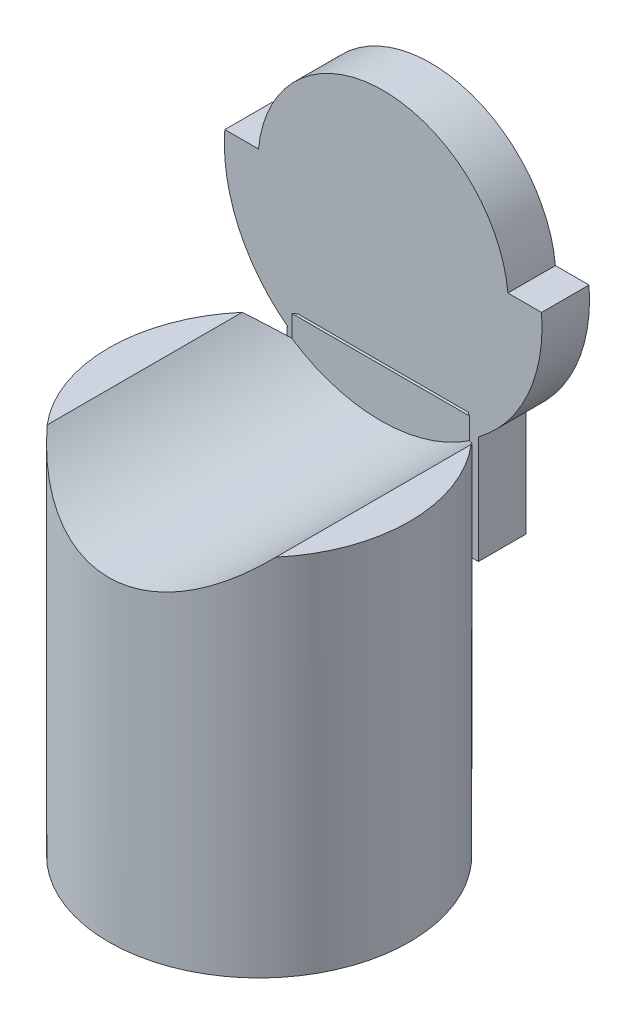
ISO-10303-21;
HEADER;
FILE_DESCRIPTION(('STEP AP214'),'2;1');
FILE_NAME('part.step','',(''),(''),'','','');
FILE_SCHEMA(('AUTOMOTIVE_DESIGN { 1 0 10303 214 1 1 1 1 }'));
ENDSEC;
DATA;
#1=APPLICATION_CONTEXT('core data for automotive mechanical design processes');
#2=APPLICATION_PROTOCOL_DEFINITION('international standard','automotive_design',2000,#1);
#3=PRODUCT_CONTEXT('',#1,'mechanical');
#4=PRODUCT('Part','Part','',(#3));
#5=PRODUCT_RELATED_PRODUCT_CATEGORY('part','',(#4));
#6=PRODUCT_DEFINITION_FORMATION('','',#4);
#7=PRODUCT_DEFINITION_CONTEXT('part definition',#1,'design');
#8=PRODUCT_DEFINITION('design','',#6,#7);
#9=PRODUCT_DEFINITION_SHAPE('','',#8);
#10=(LENGTH_UNIT() NAMED_UNIT(*) SI_UNIT(.MILLI.,.METRE.));
#11=(NAMED_UNIT(*) PLANE_ANGLE_UNIT() SI_UNIT($,.RADIAN.));
#12=(NAMED_UNIT(*) SI_UNIT($,.STERADIAN.) SOLID_ANGLE_UNIT());
#13=UNCERTAINTY_MEASURE_WITH_UNIT(LENGTH_MEASURE(1.E-05),#10,'distance_accuracy_value','');
#14=(GEOMETRIC_REPRESENTATION_CONTEXT(3) GLOBAL_UNCERTAINTY_ASSIGNED_CONTEXT((#13)) GLOBAL_UNIT_ASSIGNED_CONTEXT((#10,
#11,#12)) REPRESENTATION_CONTEXT('',''));
#15=CARTESIAN_POINT('',(0.,0.,0.));
#16=DIRECTION('',(0.,0.,1.));
#17=DIRECTION('',(1.,0.,0.));
#18=AXIS2_PLACEMENT_3D('',#15,#16,#17);
#19=CARTESIAN_POINT('',(0.,-0.09,0.));
#20=DIRECTION('',(0.,1.,0.));
#21=DIRECTION('',(0.,0.,1.));
#22=AXIS2_PLACEMENT_3D('',#19,#20,#21);
#23=CYLINDRICAL_SURFACE('',#22,0.0284941574572045);
#24=CARTESIAN_POINT('',(0.,-0.09,0.));
#25=DIRECTION('',(0.,1.,0.));
#26=DIRECTION('',(0.,0.,1.));
#27=AXIS2_PLACEMENT_3D('',#24,#25,#26);
#28=CIRCLE('',#27,0.0284941574572045);
#29=CARTESIAN_POINT('',(0.,-0.09,0.0284941574572045));
#30=VERTEX_POINT('',#29);
#31=EDGE_CURVE('E275',#30,#30,#28,.T.);
#32=ORIENTED_EDGE('',*,*,#31,.T.);
#33=EDGE_LOOP('',(#32));
#34=FACE_BOUND('',#33,.T.);
#35=CARTESIAN_POINT('',(0.,-0.021,0.));
#36=DIRECTION('',(0.,1.,0.));
#37=DIRECTION('',(0.,0.,1.));
#38=AXIS2_PLACEMENT_3D('',#35,#36,#37);
#39=CIRCLE('',#38,0.0284941574572045);
#40=CARTESIAN_POINT('',(0.0216907096295977,-0.021,0.0184778279286403));
#41=VERTEX_POINT('',#40);
#42=CARTESIAN_POINT('',(0.0216907096295977,-0.021,-0.0184778279286403));
#43=VERTEX_POINT('',#42);
#44=EDGE_CURVE('E289',#41,#43,#39,.T.);
#45=ORIENTED_EDGE('',*,*,#44,.F.);
#46=CARTESIAN_POINT('',(0.0216907096295977,-0.021,0.0184778279286403));
#47=CARTESIAN_POINT('',(0.0207367524712704,-0.021986000621325,0.0195968448702152));
#48=CARTESIAN_POINT('',(0.0196781179726419,-0.0229440670565064,0.0206644100177956));
#49=CARTESIAN_POINT('',(0.017340928678075,-0.024758530880476,0.0226629335497517));
#50=CARTESIAN_POINT('',(0.0160603755602409,-0.0256138731747389,0.0235924941927661));
#51=CARTESIAN_POINT('',(0.0136008803243965,-0.0269816322657894,0.0250697656851227));
#52=CARTESIAN_POINT('',(0.0124645623105775,-0.02752784593099,0.0256562815628791));
#53=CARTESIAN_POINT('',(0.0100792068417012,-0.028487563064238,0.0266834407901634));
#54=CARTESIAN_POINT('',(0.00883055117233049,-0.0289014957744504,0.0271245561036446));
#55=CARTESIAN_POINT('',(0.00623019718633098,-0.0295717588751649,0.027837630941062));
#56=CARTESIAN_POINT('',(0.00487761311166387,-0.0298265137302794,0.028107899731085));
#57=CARTESIAN_POINT('',(0.00212472588694179,-0.0301477706597794,0.0284485790103484));
#58=CARTESIAN_POINT('',(0.000724429523511924,-0.0302142993953682,0.0285190178044216));
#59=CARTESIAN_POINT('',(-0.00187220100014423,-0.0301567709182183,0.0284580539104407));
#60=CARTESIAN_POINT('',(-0.00306987955460269,-0.0300578743632858,0.0283532981712998));
#61=CARTESIAN_POINT('',(-0.00542276042326781,-0.0297235826625997,0.0279986592396615));
#62=CARTESIAN_POINT('',(-0.00657798950468453,-0.0294882751600134,0.0277488692305994));
#63=CARTESIAN_POINT('',(-0.0088199580356319,-0.0288970890211387,0.0271198035321874));
#64=CARTESIAN_POINT('',(-0.00990666609006205,-0.0285411555855429,0.0267404689912856));
#65=CARTESIAN_POINT('',(-0.0119970132827548,-0.0277276313748966,0.0258703367337079));
#66=CARTESIAN_POINT('',(-0.0130004050504015,-0.0272697517619963,0.0253792222279151));
#67=CARTESIAN_POINT('',(-0.0154982314973043,-0.0259675555585411,0.023976141902909));
#68=CARTESIAN_POINT('',(-0.016917033632456,-0.0250583150680098,0.0229906414047186));
#69=CARTESIAN_POINT('',(-0.0194948440481369,-0.0231093367263454,0.020848194464703));
#70=CARTESIAN_POINT('',(-0.0206556475969093,-0.0220705845734343,0.0196925322061699));
#71=CARTESIAN_POINT('',(-0.0216907096296774,-0.0210000000000609,0.0184778279287257));
#72=B_SPLINE_CURVE_WITH_KNOTS('',3,(#46,#47,#48,#49,#50,#51,#52,#53,#54,#55,#56,#57,#58,#59,#60,
#61,#62,#63,#64,#65,#66,#67,#68,#69,#70,#71),.UNSPECIFIED.,.F.,.F.,(4,2,2,2,2,2,2,2,2,2,2,2,4),
(0.,0.00532067659314667,0.0106920226780562,0.0148473906467032,0.0189891345079197,
0.0231712494542964,0.027352771997236,0.0309541656300452,0.0345532479507452,0.0381539674997257,
0.0417650215863837,0.0475876879510929,0.0533684723922075),.UNSPECIFIED.);
#73=CARTESIAN_POINT('',(-0.0216907096295977,-0.021,0.0184778279286403));
#74=VERTEX_POINT('',#73);
#75=EDGE_CURVE('E167',#41,#74,#72,.T.);
#76=ORIENTED_EDGE('',*,*,#75,.T.);
#77=CARTESIAN_POINT('',(-0.0216907096295977,-0.021,-0.0184778279286403));
#78=VERTEX_POINT('',#77);
#79=EDGE_CURVE('E166',#78,#74,#39,.T.);
#80=ORIENTED_EDGE('',*,*,#79,.F.);
#81=CARTESIAN_POINT('',(-0.0216907096295977,-0.021,-0.0184778279286403));
#82=CARTESIAN_POINT('',(-0.0209904938929021,-0.021730595797047,-0.0193048063222774));
#83=CARTESIAN_POINT('',(-0.0202345049516383,-0.0224351683652981,-0.0200951432137619));
#84=CARTESIAN_POINT('',(-0.0186109807485126,-0.0237922669701998,-0.0216025339102206));
#85=CARTESIAN_POINT('',(-0.017743445498817,-0.024444793012527,-0.0223195877231878));
#86=CARTESIAN_POINT('',(-0.0168201370567194,-0.025071295831735,-0.0230000000419954));
#87=B_SPLINE_CURVE_WITH_KNOTS('',3,(#81,#82,#83,#84,#85,#86),.UNSPECIFIED.,.F.,.F.,(4,2,4),(0.,
0.00390296908360541,0.00780593774151614),.UNSPECIFIED.);
#88=CARTESIAN_POINT('',(-0.0168201370147797,-0.0250712958388584,-0.023));
#89=VERTEX_POINT('',#88);
#90=EDGE_CURVE('E158',#78,#89,#87,.T.);
#91=ORIENTED_EDGE('',*,*,#90,.T.);
#92=DIRECTION('',(0.,1.,0.));
#93=VECTOR('',#92,1.);
#94=CARTESIAN_POINT('',(-0.0168201370147797,-0.09,-0.023));
#95=LINE('',#94,#93);
#96=CARTESIAN_POINT('',(-0.0168201370147797,-0.021,-0.023));
#97=VERTEX_POINT('',#96);
#98=EDGE_CURVE('E146',#89,#97,#95,.T.);
#99=ORIENTED_EDGE('',*,*,#98,.T.);
#100=CARTESIAN_POINT('',(-0.0161141865818899,-0.021,-0.0235));
#101=VERTEX_POINT('',#100);
#102=EDGE_CURVE('E279',#101,#97,#39,.T.);
#103=ORIENTED_EDGE('',*,*,#102,.F.);
#104=DIRECTION('',(0.,1.,0.));
#105=VECTOR('',#104,1.);
#106=CARTESIAN_POINT('',(-0.0161141865818899,-0.09,-0.0235));
#107=LINE('',#106,#105);
#108=CARTESIAN_POINT('',(-0.0161141865818899,-0.0445501957760794,-0.0235));
#109=VERTEX_POINT('',#108);
#110=EDGE_CURVE('E253',#109,#101,#107,.T.);
#111=ORIENTED_EDGE('',*,*,#110,.F.);
#112=CARTESIAN_POINT('',(0.,-0.0445501957760794,0.));
#113=DIRECTION('',(0.,-1.,0.));
#114=DIRECTION('',(0.,0.,-1.));
#115=AXIS2_PLACEMENT_3D('',#112,#113,#114);
#116=CIRCLE('',#115,0.0284941574572045);
#117=CARTESIAN_POINT('',(0.0161141865818899,-0.0445501957760794,-0.0235));
#118=VERTEX_POINT('',#117);
#119=EDGE_CURVE('E62',#118,#109,#116,.F.);
#120=ORIENTED_EDGE('',*,*,#119,.F.);
#121=DIRECTION('',(0.,1.,0.));
#122=VECTOR('',#121,1.);
#123=CARTESIAN_POINT('',(0.0161141865818899,-0.09,-0.0235));
#124=LINE('',#123,#122);
#125=CARTESIAN_POINT('',(0.0161141865818899,-0.021,-0.0235));
#126=VERTEX_POINT('',#125);
#127=EDGE_CURVE('E272',#126,#118,#124,.F.);
#128=ORIENTED_EDGE('',*,*,#127,.F.);
#129=CARTESIAN_POINT('',(0.0168201370147797,-0.021,-0.023));
#130=VERTEX_POINT('',#129);
#131=EDGE_CURVE('E274',#130,#126,#39,.T.);
#132=ORIENTED_EDGE('',*,*,#131,.F.);
#133=DIRECTION('',(0.,1.,0.));
#134=VECTOR('',#133,1.);
#135=CARTESIAN_POINT('',(0.0168201370147797,-0.09,-0.023));
#136=LINE('',#135,#134);
#137=CARTESIAN_POINT('',(0.0168201370147797,-0.0250712958388584,-0.023));
#138=VERTEX_POINT('',#137);
#139=EDGE_CURVE('E54',#130,#138,#136,.F.);
#140=ORIENTED_EDGE('',*,*,#139,.T.);
#141=CARTESIAN_POINT('',(0.0168201370147797,-0.0250712958388584,-0.023));
#142=CARTESIAN_POINT('',(0.017743445476291,-0.0244447930173228,-0.0223195877034899));
#143=CARTESIAN_POINT('',(0.0186109807393661,-0.0237922669731256,-0.0216025339050805));
#144=CARTESIAN_POINT('',(0.0202345049566047,-0.0224351683658823,-0.0200951432227943));
#145=CARTESIAN_POINT('',(0.0209904938986812,-0.0217305957971965,-0.0193048063309768));
#146=CARTESIAN_POINT('',(0.0216907096302347,-0.0210000000002096,-0.0184778279293191));
#147=B_SPLINE_CURVE_WITH_KNOTS('',3,(#141,#142,#143,#144,#145,#146),.UNSPECIFIED.,.F.,.F.,(4,2,
4),(0.,0.00390296866341909,0.00780593774975427),.UNSPECIFIED.);
#148=EDGE_CURVE('E161',#138,#43,#147,.T.);
#149=ORIENTED_EDGE('',*,*,#148,.T.);
#150=EDGE_LOOP('',(#45,#76,#80,#91,#99,#103,#111,#120,#128,#132,#140,#149));
#151=FACE_BOUND('',#150,.T.);
#152=ADVANCED_FACE('F39',(#34,#151),#23,.T.);
#153=CARTESIAN_POINT('',(0.,-0.021,0.));
#154=DIRECTION('',(0.,1.,0.));
#155=DIRECTION('',(0.,0.,1.));
#156=AXIS2_PLACEMENT_3D('',#153,#154,#155);
#157=PLANE('',#156);
#158=ORIENTED_EDGE('',*,*,#44,.T.);
#159=DIRECTION('',(0.,0.,-1.));
#160=VECTOR('',#159,1.);
#161=CARTESIAN_POINT('',(0.0216907096295977,-0.021,0.0284941574572045));
#162=LINE('',#161,#160);
#163=EDGE_CURVE('E11',#43,#41,#162,.F.);
#164=ORIENTED_EDGE('',*,*,#163,.T.);
#165=EDGE_LOOP('',(#158,#164));
#166=FACE_BOUND('',#165,.T.);
#167=ADVANCED_FACE('F288',(#166),#157,.T.);
#168=ORIENTED_EDGE('',*,*,#79,.T.);
#169=DIRECTION('',(0.,0.,-1.));
#170=VECTOR('',#169,1.);
#171=CARTESIAN_POINT('',(-0.0216907096295977,-0.021,0.0284941574572045));
#172=LINE('',#171,#170);
#173=EDGE_CURVE('E47',#74,#78,#172,.T.);
#174=ORIENTED_EDGE('',*,*,#173,.T.);
#175=EDGE_LOOP('',(#168,#174));
#176=FACE_BOUND('',#175,.T.);
#177=ADVANCED_FACE('F285',(#176),#157,.T.);
#178=ORIENTED_EDGE('',*,*,#102,.T.);
#179=DIRECTION('',(1.,0.,0.));
#180=VECTOR('',#179,1.);
#181=CARTESIAN_POINT('',(0.,-0.021,-0.023));
#182=LINE('',#181,#180);
#183=EDGE_CURVE('E150',#97,#130,#182,.T.);
#184=ORIENTED_EDGE('',*,*,#183,.T.);
#185=ORIENTED_EDGE('',*,*,#131,.T.);
#186=DIRECTION('',(1.,0.,0.));
#187=VECTOR('',#186,1.);
#188=CARTESIAN_POINT('',(0.,-0.021,-0.0235));
#189=LINE('',#188,#187);
#190=EDGE_CURVE('E278',#101,#126,#189,.T.);
#191=ORIENTED_EDGE('',*,*,#190,.F.);
#192=EDGE_LOOP('',(#178,#184,#185,#191));
#193=FACE_BOUND('',#192,.T.);
#194=ADVANCED_FACE('F292',(#193),#157,.T.);
#195=CARTESIAN_POINT('',(0.,-0.09,0.));
#196=DIRECTION('',(0.,1.,0.));
#197=DIRECTION('',(0.,0.,1.));
#198=AXIS2_PLACEMENT_3D('',#195,#196,#197);
#199=PLANE('',#198);
#200=ORIENTED_EDGE('',*,*,#31,.F.);
#201=EDGE_LOOP('',(#200));
#202=FACE_BOUND('',#201,.T.);
#203=ADVANCED_FACE('F345',(#202),#199,.F.);
#204=CARTESIAN_POINT('',(0.,0.,-0.0325));
#205=DIRECTION('',(0.,0.,1.));
#206=DIRECTION('',(1.,0.,0.));
#207=AXIS2_PLACEMENT_3D('',#204,#205,#206);
#208=CYLINDRICAL_SURFACE('',#207,0.0300954498475561);
#209=CARTESIAN_POINT('',(0.,0.,-0.0235));
#210=DIRECTION('',(0.,0.,1.));
#211=DIRECTION('',(1.,0.,0.));
#212=AXIS2_PLACEMENT_3D('',#209,#210,#211);
#213=CIRCLE('',#212,0.0300954498475561);
#214=CARTESIAN_POINT('',(0.0180399904553531,-0.0240893097845815,-0.0235));
#215=VERTEX_POINT('',#214);
#216=CARTESIAN_POINT('',(0.0300063666209745,0.00231388498729576,-0.0235));
#217=VERTEX_POINT('',#216);
#218=EDGE_CURVE('E195',#215,#217,#213,.T.);
#219=ORIENTED_EDGE('',*,*,#218,.F.);
#220=DIRECTION('',(0.,0.,1.));
#221=VECTOR('',#220,1.);
#222=CARTESIAN_POINT('',(0.0180399904553531,-0.0240893097845815,-0.0325));
#223=LINE('',#222,#221);
#224=CARTESIAN_POINT('',(0.0180399904553531,-0.0240893097845815,-0.0325));
#225=VERTEX_POINT('',#224);
#226=EDGE_CURVE('E251',#225,#215,#223,.T.);
#227=ORIENTED_EDGE('',*,*,#226,.F.);
#228=CARTESIAN_POINT('',(0.,0.,-0.0325));
#229=DIRECTION('',(0.,0.,1.));
#230=DIRECTION('',(1.,0.,0.));
#231=AXIS2_PLACEMENT_3D('',#228,#229,#230);
#232=CIRCLE('',#231,0.0300954498475561);
#233=CARTESIAN_POINT('',(0.0300063666209745,0.00231388498729576,-0.0325));
#234=VERTEX_POINT('',#233);
#235=EDGE_CURVE('E196',#225,#234,#232,.T.);
#236=ORIENTED_EDGE('',*,*,#235,.T.);
#237=DIRECTION('',(0.,0.,1.));
#238=VECTOR('',#237,1.);
#239=CARTESIAN_POINT('',(0.0300063666209745,0.00231388498729576,-0.0325));
#240=LINE('',#239,#238);
#241=EDGE_CURVE('E224',#234,#217,#240,.T.);
#242=ORIENTED_EDGE('',*,*,#241,.T.);
#243=EDGE_LOOP('',(#219,#227,#236,#242));
#244=FACE_BOUND('',#243,.T.);
#245=ADVANCED_FACE('F305',(#244),#208,.T.);
#246=CARTESIAN_POINT('',(0.0180399904553531,-0.0240893097845815,-0.0325));
#247=DIRECTION('',(1.,0.,0.));
#248=DIRECTION('',(0.,0.,-1.));
#249=AXIS2_PLACEMENT_3D('',#246,#247,#248);
#250=PLANE('',#249);
#251=DIRECTION('',(0.,1.,0.));
#252=VECTOR('',#251,1.);
#253=CARTESIAN_POINT('',(0.0180399904553531,-0.0240893097845815,-0.0235));
#254=LINE('',#253,#252);
#255=CARTESIAN_POINT('',(0.0180399904553531,-0.0445501957760794,-0.0235));
#256=VERTEX_POINT('',#255);
#257=EDGE_CURVE('E200',#256,#215,#254,.T.);
#258=ORIENTED_EDGE('',*,*,#257,.F.);
#259=DIRECTION('',(0.,0.,1.));
#260=VECTOR('',#259,1.);
#261=CARTESIAN_POINT('',(0.0180399904553531,-0.0445501957760794,-0.0325));
#262=LINE('',#261,#260);
#263=CARTESIAN_POINT('',(0.0180399904553531,-0.0445501957760794,-0.0325));
#264=VERTEX_POINT('',#263);
#265=EDGE_CURVE('E254',#264,#256,#262,.T.);
#266=ORIENTED_EDGE('',*,*,#265,.F.);
#267=DIRECTION('',(0.,1.,0.));
#268=VECTOR('',#267,1.);
#269=CARTESIAN_POINT('',(0.0180399904553531,-0.0240893097845815,-0.0325));
#270=LINE('',#269,#268);
#271=EDGE_CURVE('E221',#264,#225,#270,.T.);
#272=ORIENTED_EDGE('',*,*,#271,.T.);
#273=ORIENTED_EDGE('',*,*,#226,.T.);
#274=EDGE_LOOP('',(#258,#266,#272,#273));
#275=FACE_BOUND('',#274,.T.);
#276=ADVANCED_FACE('F301',(#275),#250,.T.);
#277=CARTESIAN_POINT('',(0.0180399904553531,-0.0445501957760794,-0.0325));
#278=DIRECTION('',(0.,-1.,0.));
#279=DIRECTION('',(0.,0.,-1.));
#280=AXIS2_PLACEMENT_3D('',#277,#278,#279);
#281=PLANE('',#280);
#282=DIRECTION('',(1.,0.,0.));
#283=VECTOR('',#282,1.);
#284=CARTESIAN_POINT('',(0.0180399904553531,-0.0445501957760794,-0.0235));
#285=LINE('',#284,#283);
#286=EDGE_CURVE('E245',#118,#256,#285,.T.);
#287=ORIENTED_EDGE('',*,*,#286,.F.);
#288=ORIENTED_EDGE('',*,*,#119,.T.);
#289=CARTESIAN_POINT('',(-0.018210348579123,-0.0445501957760794,-0.0235));
#290=VERTEX_POINT('',#289);
#291=EDGE_CURVE('E246',#290,#109,#285,.T.);
#292=ORIENTED_EDGE('',*,*,#291,.F.);
#293=DIRECTION('',(0.,0.,1.));
#294=VECTOR('',#293,1.);
#295=CARTESIAN_POINT('',(-0.018210348579123,-0.0445501957760794,-0.0325));
#296=LINE('',#295,#294);
#297=CARTESIAN_POINT('',(-0.018210348579123,-0.0445501957760794,-0.0325));
#298=VERTEX_POINT('',#297);
#299=EDGE_CURVE('E257',#298,#290,#296,.T.);
#300=ORIENTED_EDGE('',*,*,#299,.F.);
#301=DIRECTION('',(1.,0.,0.));
#302=VECTOR('',#301,1.);
#303=CARTESIAN_POINT('',(0.0180399904553531,-0.0445501957760794,-0.0325));
#304=LINE('',#303,#302);
#305=EDGE_CURVE('E218',#298,#264,#304,.T.);
#306=ORIENTED_EDGE('',*,*,#305,.T.);
#307=ORIENTED_EDGE('',*,*,#265,.T.);
#308=EDGE_LOOP('',(#287,#288,#292,#300,#306,#307));
#309=FACE_BOUND('',#308,.T.);
#310=ADVANCED_FACE('F297',(#309),#281,.T.);
#311=CARTESIAN_POINT('',(-0.018210348579123,-0.0240893097845815,-0.0325));
#312=DIRECTION('',(-1.,0.,0.));
#313=DIRECTION('',(0.,0.,1.));
#314=AXIS2_PLACEMENT_3D('',#311,#312,#313);
#315=PLANE('',#314);
#316=DIRECTION('',(0.,-1.,0.));
#317=VECTOR('',#316,1.);
#318=CARTESIAN_POINT('',(-0.018210348579123,-0.0240893097845815,-0.0235));
#319=LINE('',#318,#317);
#320=CARTESIAN_POINT('',(-0.018210348579123,-0.0240893097845815,-0.0235));
#321=VERTEX_POINT('',#320);
#322=EDGE_CURVE('E242',#321,#290,#319,.T.);
#323=ORIENTED_EDGE('',*,*,#322,.F.);
#324=DIRECTION('',(0.,0.,1.));
#325=VECTOR('',#324,1.);
#326=CARTESIAN_POINT('',(-0.018210348579123,-0.0240893097845815,-0.0325));
#327=LINE('',#326,#325);
#328=CARTESIAN_POINT('',(-0.018210348579123,-0.0240893097845815,-0.0325));
#329=VERTEX_POINT('',#328);
#330=EDGE_CURVE('E259',#329,#321,#327,.T.);
#331=ORIENTED_EDGE('',*,*,#330,.F.);
#332=DIRECTION('',(0.,-1.,0.));
#333=VECTOR('',#332,1.);
#334=CARTESIAN_POINT('',(-0.018210348579123,-0.0240893097845815,-0.0325));
#335=LINE('',#334,#333);
#336=EDGE_CURVE('E215',#329,#298,#335,.T.);
#337=ORIENTED_EDGE('',*,*,#336,.T.);
#338=ORIENTED_EDGE('',*,*,#299,.T.);
#339=EDGE_LOOP('',(#323,#331,#337,#338));
#340=FACE_BOUND('',#339,.T.);
#341=ADVANCED_FACE('F329',(#340),#315,.T.);
#342=CARTESIAN_POINT('',(-0.0180399904553531,-0.0240893097845815,-0.0325));
#343=DIRECTION('',(0.,1.,0.));
#344=DIRECTION('',(0.,0.,1.));
#345=AXIS2_PLACEMENT_3D('',#342,#343,#344);
#346=PLANE('',#345);
#347=DIRECTION('',(-1.,0.,0.));
#348=VECTOR('',#347,1.);
#349=CARTESIAN_POINT('',(-0.0180399904553531,-0.0240893097845815,-0.0235));
#350=LINE('',#349,#348);
#351=CARTESIAN_POINT('',(-0.0180399904553531,-0.0240893097845815,-0.0235));
#352=VERTEX_POINT('',#351);
#353=EDGE_CURVE('E239',#352,#321,#350,.T.);
#354=ORIENTED_EDGE('',*,*,#353,.F.);
#355=DIRECTION('',(0.,0.,1.));
#356=VECTOR('',#355,1.);
#357=CARTESIAN_POINT('',(-0.0180399904553531,-0.0240893097845815,-0.0325));
#358=LINE('',#357,#356);
#359=CARTESIAN_POINT('',(-0.0180399904553531,-0.0240893097845815,-0.0325));
#360=VERTEX_POINT('',#359);
#361=EDGE_CURVE('E261',#360,#352,#358,.T.);
#362=ORIENTED_EDGE('',*,*,#361,.F.);
#363=DIRECTION('',(-1.,0.,0.));
#364=VECTOR('',#363,1.);
#365=CARTESIAN_POINT('',(-0.0180399904553531,-0.0240893097845815,-0.0325));
#366=LINE('',#365,#364);
#367=EDGE_CURVE('E212',#360,#329,#366,.T.);
#368=ORIENTED_EDGE('',*,*,#367,.T.);
#369=ORIENTED_EDGE('',*,*,#330,.T.);
#370=EDGE_LOOP('',(#354,#362,#368,#369));
#371=FACE_BOUND('',#370,.T.);
#372=ADVANCED_FACE('F325',(#371),#346,.T.);
#373=CARTESIAN_POINT('',(0.,0.,-0.0325));
#374=DIRECTION('',(0.,0.,1.));
#375=DIRECTION('',(1.,0.,0.));
#376=AXIS2_PLACEMENT_3D('',#373,#374,#375);
#377=CYLINDRICAL_SURFACE('',#376,0.0300954498475561);
#378=CARTESIAN_POINT('',(0.,0.,-0.0235));
#379=DIRECTION('',(0.,0.,1.));
#380=DIRECTION('',(1.,0.,0.));
#381=AXIS2_PLACEMENT_3D('',#378,#379,#380);
#382=CIRCLE('',#381,0.0300954498475561);
#383=CARTESIAN_POINT('',(-0.0300063666209745,0.00231388498729576,-0.0235));
#384=VERTEX_POINT('',#383);
#385=EDGE_CURVE('E236',#384,#352,#382,.T.);
#386=ORIENTED_EDGE('',*,*,#385,.F.);
#387=DIRECTION('',(0.,0.,1.));
#388=VECTOR('',#387,1.);
#389=CARTESIAN_POINT('',(-0.0300063666209745,0.00231388498729576,-0.0325));
#390=LINE('',#389,#388);
#391=CARTESIAN_POINT('',(-0.0300063666209745,0.00231388498729576,-0.0325));
#392=VERTEX_POINT('',#391);
#393=EDGE_CURVE('E263',#392,#384,#390,.T.);
#394=ORIENTED_EDGE('',*,*,#393,.F.);
#395=CARTESIAN_POINT('',(0.,0.,-0.0325));
#396=DIRECTION('',(0.,0.,1.));
#397=DIRECTION('',(1.,0.,0.));
#398=AXIS2_PLACEMENT_3D('',#395,#396,#397);
#399=CIRCLE('',#398,0.0300954498475561);
#400=EDGE_CURVE('E209',#392,#360,#399,.T.);
#401=ORIENTED_EDGE('',*,*,#400,.T.);
#402=ORIENTED_EDGE('',*,*,#361,.T.);
#403=EDGE_LOOP('',(#386,#394,#401,#402));
#404=FACE_BOUND('',#403,.T.);
#405=ADVANCED_FACE('F321',(#404),#377,.T.);
#406=CARTESIAN_POINT('',(-0.0300063666209745,0.00231388498729576,-0.0325));
#407=DIRECTION('',(0.,1.,0.));
#408=DIRECTION('',(0.,0.,1.));
#409=AXIS2_PLACEMENT_3D('',#406,#407,#408);
#410=PLANE('',#409);
#411=DIRECTION('',(-1.,0.,0.));
#412=VECTOR('',#411,1.);
#413=CARTESIAN_POINT('',(-0.0300063666209745,0.00231388498729576,-0.0235));
#414=LINE('',#413,#412);
#415=CARTESIAN_POINT('',(-0.023629395557412,0.00231388498729576,-0.0235));
#416=VERTEX_POINT('',#415);
#417=EDGE_CURVE('E233',#416,#384,#414,.T.);
#418=ORIENTED_EDGE('',*,*,#417,.F.);
#419=DIRECTION('',(0.,0.,1.));
#420=VECTOR('',#419,1.);
#421=CARTESIAN_POINT('',(-0.023629395557412,0.00231388498729576,-0.0325));
#422=LINE('',#421,#420);
#423=CARTESIAN_POINT('',(-0.023629395557412,0.00231388498729576,-0.0325));
#424=VERTEX_POINT('',#423);
#425=EDGE_CURVE('E265',#424,#416,#422,.T.);
#426=ORIENTED_EDGE('',*,*,#425,.F.);
#427=DIRECTION('',(-1.,0.,0.));
#428=VECTOR('',#427,1.);
#429=CARTESIAN_POINT('',(-0.0300063666209745,0.00231388498729576,-0.0325));
#430=LINE('',#429,#428);
#431=EDGE_CURVE('E206',#424,#392,#430,.T.);
#432=ORIENTED_EDGE('',*,*,#431,.T.);
#433=ORIENTED_EDGE('',*,*,#393,.T.);
#434=EDGE_LOOP('',(#418,#426,#432,#433));
#435=FACE_BOUND('',#434,.T.);
#436=ADVANCED_FACE('F317',(#435),#410,.T.);
#437=CARTESIAN_POINT('',(0.,0.,-0.0325));
#438=DIRECTION('',(0.,0.,1.));
#439=DIRECTION('',(1.,0.,0.));
#440=AXIS2_PLACEMENT_3D('',#437,#438,#439);
#441=CYLINDRICAL_SURFACE('',#440,0.023742417697932);
#442=CARTESIAN_POINT('',(0.,0.,-0.0235));
#443=DIRECTION('',(0.,0.,1.));
#444=DIRECTION('',(1.,0.,0.));
#445=AXIS2_PLACEMENT_3D('',#442,#443,#444);
#446=CIRCLE('',#445,0.023742417697932);
#447=CARTESIAN_POINT('',(0.023629395557412,0.00231388498729576,-0.0235));
#448=VERTEX_POINT('',#447);
#449=EDGE_CURVE('E230',#448,#416,#446,.T.);
#450=ORIENTED_EDGE('',*,*,#449,.F.);
#451=DIRECTION('',(0.,0.,1.));
#452=VECTOR('',#451,1.);
#453=CARTESIAN_POINT('',(0.023629395557412,0.00231388498729576,-0.0325));
#454=LINE('',#453,#452);
#455=CARTESIAN_POINT('',(0.023629395557412,0.00231388498729576,-0.0325));
#456=VERTEX_POINT('',#455);
#457=EDGE_CURVE('E267',#456,#448,#454,.T.);
#458=ORIENTED_EDGE('',*,*,#457,.F.);
#459=CARTESIAN_POINT('',(0.,0.,-0.0325));
#460=DIRECTION('',(0.,0.,1.));
#461=DIRECTION('',(1.,0.,0.));
#462=AXIS2_PLACEMENT_3D('',#459,#460,#461);
#463=CIRCLE('',#462,0.023742417697932);
#464=EDGE_CURVE('E203',#456,#424,#463,.T.);
#465=ORIENTED_EDGE('',*,*,#464,.T.);
#466=ORIENTED_EDGE('',*,*,#425,.T.);
#467=EDGE_LOOP('',(#450,#458,#465,#466));
#468=FACE_BOUND('',#467,.T.);
#469=ADVANCED_FACE('F313',(#468),#441,.T.);
#470=CARTESIAN_POINT('',(0.023629395557412,0.00231388498729576,-0.0325));
#471=DIRECTION('',(0.,1.,0.));
#472=DIRECTION('',(0.,0.,1.));
#473=AXIS2_PLACEMENT_3D('',#470,#471,#472);
#474=PLANE('',#473);
#475=DIRECTION('',(-1.,0.,0.));
#476=VECTOR('',#475,1.);
#477=CARTESIAN_POINT('',(0.023629395557412,0.00231388498729576,-0.0235));
#478=LINE('',#477,#476);
#479=EDGE_CURVE('E227',#217,#448,#478,.T.);
#480=ORIENTED_EDGE('',*,*,#479,.F.);
#481=ORIENTED_EDGE('',*,*,#241,.F.);
#482=DIRECTION('',(-1.,0.,0.));
#483=VECTOR('',#482,1.);
#484=CARTESIAN_POINT('',(0.023629395557412,0.00231388498729576,-0.0325));
#485=LINE('',#484,#483);
#486=EDGE_CURVE('E199',#234,#456,#485,.T.);
#487=ORIENTED_EDGE('',*,*,#486,.T.);
#488=ORIENTED_EDGE('',*,*,#457,.T.);
#489=EDGE_LOOP('',(#480,#481,#487,#488));
#490=FACE_BOUND('',#489,.T.);
#491=ADVANCED_FACE('F309',(#490),#474,.T.);
#492=CARTESIAN_POINT('',(0.,0.,-0.0325));
#493=DIRECTION('',(0.,0.,1.));
#494=DIRECTION('',(1.,0.,0.));
#495=AXIS2_PLACEMENT_3D('',#492,#493,#494);
#496=PLANE('',#495);
#497=ORIENTED_EDGE('',*,*,#235,.F.);
#498=ORIENTED_EDGE('',*,*,#271,.F.);
#499=ORIENTED_EDGE('',*,*,#305,.F.);
#500=ORIENTED_EDGE('',*,*,#336,.F.);
#501=ORIENTED_EDGE('',*,*,#367,.F.);
#502=ORIENTED_EDGE('',*,*,#400,.F.);
#503=ORIENTED_EDGE('',*,*,#431,.F.);
#504=ORIENTED_EDGE('',*,*,#464,.F.);
#505=ORIENTED_EDGE('',*,*,#486,.F.);
#506=EDGE_LOOP('',(#497,#498,#499,#500,#501,#502,#503,#504,#505));
#507=FACE_BOUND('',#506,.T.);
#508=ADVANCED_FACE('F186',(#507),#496,.F.);
#509=CARTESIAN_POINT('',(0.,0.,-0.0235));
#510=DIRECTION('',(0.,0.,1.));
#511=DIRECTION('',(1.,0.,0.));
#512=AXIS2_PLACEMENT_3D('',#509,#510,#511);
#513=PLANE('',#512);
#514=ORIENTED_EDGE('',*,*,#190,.T.);
#515=ORIENTED_EDGE('',*,*,#127,.T.);
#516=ORIENTED_EDGE('',*,*,#286,.T.);
#517=ORIENTED_EDGE('',*,*,#257,.T.);
#518=ORIENTED_EDGE('',*,*,#218,.T.);
#519=ORIENTED_EDGE('',*,*,#479,.T.);
#520=ORIENTED_EDGE('',*,*,#449,.T.);
#521=ORIENTED_EDGE('',*,*,#417,.T.);
#522=ORIENTED_EDGE('',*,*,#385,.T.);
#523=ORIENTED_EDGE('',*,*,#353,.T.);
#524=ORIENTED_EDGE('',*,*,#322,.T.);
#525=ORIENTED_EDGE('',*,*,#291,.T.);
#526=ORIENTED_EDGE('',*,*,#110,.T.);
#527=EDGE_LOOP('',(#514,#515,#516,#517,#518,#519,#520,#521,#522,#523,#524,#525,#526));
#528=FACE_BOUND('',#527,.T.);
#529=ADVANCED_FACE('F185',(#528),#513,.T.);
#530=CARTESIAN_POINT('',(0.,0.,0.0284941574572045));
#531=DIRECTION('',(0.,0.,-1.));
#532=DIRECTION('',(-1.,0.,0.));
#533=AXIS2_PLACEMENT_3D('',#530,#531,#532);
#534=CYLINDRICAL_SURFACE('',#533,0.0301908410653881);
#535=CARTESIAN_POINT('',(0.,0.,-0.023));
#536=DIRECTION('',(0.,0.,1.));
#537=DIRECTION('',(1.,0.,0.));
#538=AXIS2_PLACEMENT_3D('',#535,#536,#537);
#539=CIRCLE('',#538,0.0301908410653881);
#540=EDGE_CURVE('E149',#89,#138,#539,.T.);
#541=ORIENTED_EDGE('',*,*,#540,.F.);
#542=ORIENTED_EDGE('',*,*,#90,.F.);
#543=ORIENTED_EDGE('',*,*,#173,.F.);
#544=ORIENTED_EDGE('',*,*,#75,.F.);
#545=ORIENTED_EDGE('',*,*,#163,.F.);
#546=ORIENTED_EDGE('',*,*,#148,.F.);
#547=EDGE_LOOP('',(#541,#542,#543,#544,#545,#546));
#548=FACE_BOUND('',#547,.T.);
#549=ADVANCED_FACE('F156',(#548),#534,.F.);
#550=CARTESIAN_POINT('',(0.,0.,-0.023));
#551=DIRECTION('',(0.,0.,1.));
#552=DIRECTION('',(1.,0.,0.));
#553=AXIS2_PLACEMENT_3D('',#550,#551,#552);
#554=PLANE('',#553);
#555=ORIENTED_EDGE('',*,*,#183,.F.);
#556=ORIENTED_EDGE('',*,*,#98,.F.);
#557=ORIENTED_EDGE('',*,*,#540,.T.);
#558=ORIENTED_EDGE('',*,*,#139,.F.);
#559=EDGE_LOOP('',(#555,#556,#557,#558));
#560=FACE_BOUND('',#559,.T.);
#561=ADVANCED_FACE('F148',(#560),#554,.T.);
#562=CLOSED_SHELL('',(#152,#167,#177,#194,#203,#245,#276,#310,#341,#372,#405,#436,#469,#491,
#508,#529,#549,#561));
#563=MANIFOLD_SOLID_BREP('B2',#562);
#564=ADVANCED_BREP_SHAPE_REPRESENTATION('',(#18,#563),#14);
#565=SHAPE_DEFINITION_REPRESENTATION(#9,#564);
ENDSEC;
END-ISO-10303-21;
